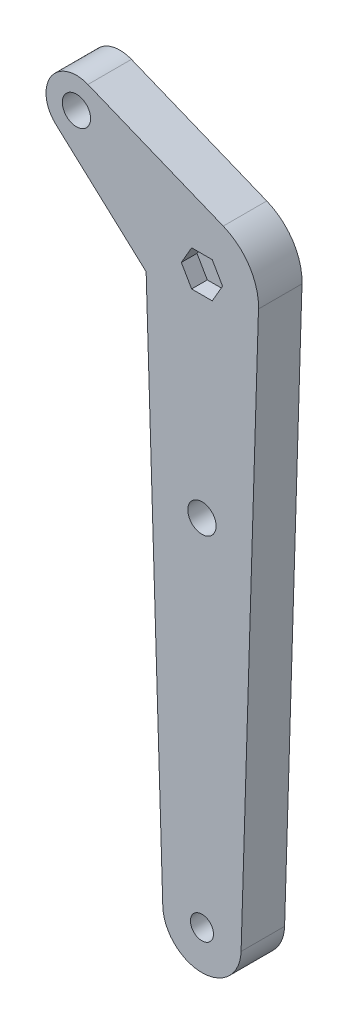
ISO-10303-21;
HEADER;
FILE_DESCRIPTION(('STEP AP214'),'2;1');
FILE_NAME('part.step','',(''),(''),'','','');
FILE_SCHEMA(('AUTOMOTIVE_DESIGN { 1 0 10303 214 1 1 1 1 }'));
ENDSEC;
DATA;
#1=APPLICATION_CONTEXT('core data for automotive mechanical design processes');
#2=APPLICATION_PROTOCOL_DEFINITION('international standard','automotive_design',2000,#1);
#3=PRODUCT_CONTEXT('',#1,'mechanical');
#4=PRODUCT('Part','Part','',(#3));
#5=PRODUCT_RELATED_PRODUCT_CATEGORY('part','',(#4));
#6=PRODUCT_DEFINITION_FORMATION('','',#4);
#7=PRODUCT_DEFINITION_CONTEXT('part definition',#1,'design');
#8=PRODUCT_DEFINITION('design','',#6,#7);
#9=PRODUCT_DEFINITION_SHAPE('','',#8);
#10=(LENGTH_UNIT() NAMED_UNIT(*) SI_UNIT(.MILLI.,.METRE.));
#11=(NAMED_UNIT(*) PLANE_ANGLE_UNIT() SI_UNIT($,.RADIAN.));
#12=(NAMED_UNIT(*) SI_UNIT($,.STERADIAN.) SOLID_ANGLE_UNIT());
#13=UNCERTAINTY_MEASURE_WITH_UNIT(LENGTH_MEASURE(1.E-05),#10,'distance_accuracy_value','');
#14=(GEOMETRIC_REPRESENTATION_CONTEXT(3) GLOBAL_UNCERTAINTY_ASSIGNED_CONTEXT((#13)) GLOBAL_UNIT_ASSIGNED_CONTEXT((#10,
#11,#12)) REPRESENTATION_CONTEXT('',''));
#15=CARTESIAN_POINT('',(0.,0.,0.));
#16=DIRECTION('',(0.,0.,1.));
#17=DIRECTION('',(1.,0.,0.));
#18=AXIS2_PLACEMENT_3D('',#15,#16,#17);
#19=CARTESIAN_POINT('',(300.,170.,358.));
#20=DIRECTION('',(0.,0.,1.));
#21=DIRECTION('',(1.,0.,0.));
#22=AXIS2_PLACEMENT_3D('',#19,#20,#21);
#23=PLANE('',#22);
#24=CARTESIAN_POINT('',(300.,121.5,358.));
#25=DIRECTION('',(0.,0.,1.));
#26=DIRECTION('',(1.,0.,0.));
#27=AXIS2_PLACEMENT_3D('',#24,#25,#26);
#28=CIRCLE('',#27,3.24999999999998);
#29=CARTESIAN_POINT('',(303.25,121.5,358.));
#30=VERTEX_POINT('',#29);
#31=EDGE_CURVE('E174',#30,#30,#28,.F.);
#32=ORIENTED_EDGE('',*,*,#31,.T.);
#33=EDGE_LOOP('',(#32));
#34=FACE_BOUND('',#33,.T.);
#35=CARTESIAN_POINT('',(271.161871074297,188.195504288361,358.));
#36=DIRECTION('',(0.,0.,1.));
#37=DIRECTION('',(1.,0.,0.));
#38=AXIS2_PLACEMENT_3D('',#35,#36,#37);
#39=CIRCLE('',#38,3.24999999999998);
#40=CARTESIAN_POINT('',(274.411871074297,188.195504288361,358.));
#41=VERTEX_POINT('',#40);
#42=EDGE_CURVE('E468',#41,#41,#39,.F.);
#43=ORIENTED_EDGE('',*,*,#42,.T.);
#44=EDGE_LOOP('',(#43));
#45=FACE_BOUND('',#44,.T.);
#46=DIRECTION('',(0.0307692307692308,0.999526515124971,0.));
#47=VECTOR('',#46,1.);
#48=CARTESIAN_POINT('',(308.995738636125,39.7230769230769,358.));
#49=LINE('',#48,#47);
#50=CARTESIAN_POINT('',(308.995738636125,39.7230769230769,358.));
#51=VERTEX_POINT('',#50);
#52=CARTESIAN_POINT('',(312.993844696625,169.6,358.));
#53=VERTEX_POINT('',#52);
#54=EDGE_CURVE('E226',#51,#53,#49,.T.);
#55=ORIENTED_EDGE('',*,*,#54,.T.);
#56=CARTESIAN_POINT('',(300.,170.,358.));
#57=DIRECTION('',(0.,0.,1.));
#58=DIRECTION('',(1.,0.,0.));
#59=AXIS2_PLACEMENT_3D('',#56,#57,#58);
#60=CIRCLE('',#59,13.);
#61=CARTESIAN_POINT('',(304.894163453425,182.043552801859,358.));
#62=VERTEX_POINT('',#61);
#63=EDGE_CURVE('E219',#53,#62,#60,.T.);
#64=ORIENTED_EDGE('',*,*,#63,.T.);
#65=DIRECTION('',(-0.926427138604526,0.376474111801902,0.));
#66=VECTOR('',#65,1.);
#67=CARTESIAN_POINT('',(304.894163453425,182.043552801859,358.));
#68=LINE('',#67,#66);
#69=CARTESIAN_POINT('',(273.79718985691,194.680494258593,358.));
#70=VERTEX_POINT('',#69);
#71=EDGE_CURVE('E192',#62,#70,#68,.T.);
#72=ORIENTED_EDGE('',*,*,#71,.T.);
#73=CARTESIAN_POINT('',(271.161871074297,188.195504288361,358.));
#74=DIRECTION('',(0.,0.,1.));
#75=DIRECTION('',(1.,0.,0.));
#76=AXIS2_PLACEMENT_3D('',#73,#74,#75);
#77=CIRCLE('',#76,7.);
#78=CARTESIAN_POINT('',(266.443148537552,183.025044190728,358.));
#79=VERTEX_POINT('',#78);
#80=EDGE_CURVE('E194',#70,#79,#77,.T.);
#81=ORIENTED_EDGE('',*,*,#80,.T.);
#82=DIRECTION('',(0.738637156804687,-0.674103219535026,0.));
#83=VECTOR('',#82,1.);
#84=CARTESIAN_POINT('',(266.443148537552,183.025044190728,358.));
#85=LINE('',#84,#83);
#86=CARTESIAN_POINT('',(287.175336792298,164.104205018504,358.));
#87=VERTEX_POINT('',#86);
#88=EDGE_CURVE('E197',#79,#87,#85,.T.);
#89=ORIENTED_EDGE('',*,*,#88,.T.);
#90=DIRECTION('',(0.0307692307692308,-0.999526515124971,0.));
#91=VECTOR('',#90,1.);
#92=CARTESIAN_POINT('',(287.006155303375,169.6,358.));
#93=LINE('',#92,#91);
#94=CARTESIAN_POINT('',(291.004261363875,39.7230769230769,358.));
#95=VERTEX_POINT('',#94);
#96=EDGE_CURVE('E221',#87,#95,#93,.T.);
#97=ORIENTED_EDGE('',*,*,#96,.T.);
#98=CARTESIAN_POINT('',(300.,40.,358.));
#99=DIRECTION('',(0.,0.,1.));
#100=DIRECTION('',(1.,0.,0.));
#101=AXIS2_PLACEMENT_3D('',#98,#99,#100);
#102=CIRCLE('',#101,9.00000000000002);
#103=EDGE_CURVE('E224',#95,#51,#102,.T.);
#104=ORIENTED_EDGE('',*,*,#103,.T.);
#105=EDGE_LOOP('',(#55,#64,#72,#81,#89,#97,#104));
#106=FACE_BOUND('',#105,.T.);
#107=CARTESIAN_POINT('',(300.,40.,358.));
#108=DIRECTION('',(0.,0.,1.));
#109=DIRECTION('',(1.,0.,0.));
#110=AXIS2_PLACEMENT_3D('',#107,#108,#109);
#111=CIRCLE('',#110,2.64999999999999);
#112=CARTESIAN_POINT('',(302.65,40.,358.));
#113=VERTEX_POINT('',#112);
#114=EDGE_CURVE('E213',#113,#113,#111,.T.);
#115=ORIENTED_EDGE('',*,*,#114,.F.);
#116=EDGE_LOOP('',(#115));
#117=FACE_BOUND('',#116,.T.);
#118=DIRECTION('',(-0.499999999999998,0.86602540378444,0.));
#119=VECTOR('',#118,1.);
#120=CARTESIAN_POINT('',(304.734272207355,170.,358.));
#121=LINE('',#120,#119);
#122=CARTESIAN_POINT('',(304.734272207355,170.,358.));
#123=VERTEX_POINT('',#122);
#124=CARTESIAN_POINT('',(302.367136103677,174.1,358.));
#125=VERTEX_POINT('',#124);
#126=EDGE_CURVE('E148',#123,#125,#121,.T.);
#127=ORIENTED_EDGE('',*,*,#126,.F.);
#128=DIRECTION('',(0.499999999999998,0.86602540378444,0.));
#129=VECTOR('',#128,1.);
#130=CARTESIAN_POINT('',(302.367136103677,165.9,358.));
#131=LINE('',#130,#129);
#132=CARTESIAN_POINT('',(302.367136103677,165.9,358.));
#133=VERTEX_POINT('',#132);
#134=EDGE_CURVE('E137',#133,#123,#131,.T.);
#135=ORIENTED_EDGE('',*,*,#134,.F.);
#136=DIRECTION('',(1.,0.,0.));
#137=VECTOR('',#136,1.);
#138=CARTESIAN_POINT('',(297.632863896323,165.9,358.));
#139=LINE('',#138,#137);
#140=CARTESIAN_POINT('',(297.632863896323,165.9,358.));
#141=VERTEX_POINT('',#140);
#142=EDGE_CURVE('E170',#141,#133,#139,.T.);
#143=ORIENTED_EDGE('',*,*,#142,.F.);
#144=DIRECTION('',(0.499999999999998,-0.86602540378444,0.));
#145=VECTOR('',#144,1.);
#146=CARTESIAN_POINT('',(295.265727792645,170.,358.));
#147=LINE('',#146,#145);
#148=CARTESIAN_POINT('',(295.265727792645,170.,358.));
#149=VERTEX_POINT('',#148);
#150=EDGE_CURVE('E168',#149,#141,#147,.T.);
#151=ORIENTED_EDGE('',*,*,#150,.F.);
#152=DIRECTION('',(-0.499999999999998,-0.86602540378444,0.));
#153=VECTOR('',#152,1.);
#154=CARTESIAN_POINT('',(297.632863896323,174.1,358.));
#155=LINE('',#154,#153);
#156=CARTESIAN_POINT('',(297.632863896323,174.1,358.));
#157=VERTEX_POINT('',#156);
#158=EDGE_CURVE('E163',#157,#149,#155,.T.);
#159=ORIENTED_EDGE('',*,*,#158,.F.);
#160=DIRECTION('',(-1.,0.,0.));
#161=VECTOR('',#160,1.);
#162=CARTESIAN_POINT('',(302.367136103677,174.1,358.));
#163=LINE('',#162,#161);
#164=EDGE_CURVE('E161',#125,#157,#163,.T.);
#165=ORIENTED_EDGE('',*,*,#164,.F.);
#166=EDGE_LOOP('',(#127,#135,#143,#151,#159,#165));
#167=FACE_BOUND('',#166,.T.);
#168=ADVANCED_FACE('F39',(#34,#45,#106,#117,#167),#23,.T.);
#169=CARTESIAN_POINT('',(300.,170.,358.));
#170=DIRECTION('',(0.,0.,-1.));
#171=DIRECTION('',(-1.,0.,0.));
#172=AXIS2_PLACEMENT_3D('',#169,#170,#171);
#173=CYLINDRICAL_SURFACE('',#172,13.);
#174=DIRECTION('',(0.,0.,-1.));
#175=VECTOR('',#174,1.);
#176=CARTESIAN_POINT('',(304.894163453425,182.043552801859,358.));
#177=LINE('',#176,#175);
#178=CARTESIAN_POINT('',(304.894163453425,182.043552801859,348.));
#179=VERTEX_POINT('',#178);
#180=EDGE_CURVE('E62',#62,#179,#177,.T.);
#181=ORIENTED_EDGE('',*,*,#180,.F.);
#182=ORIENTED_EDGE('',*,*,#63,.F.);
#183=DIRECTION('',(0.,0.,-1.));
#184=VECTOR('',#183,1.);
#185=CARTESIAN_POINT('',(312.993844696625,169.6,358.));
#186=LINE('',#185,#184);
#187=CARTESIAN_POINT('',(312.993844696625,169.6,348.));
#188=VERTEX_POINT('',#187);
#189=EDGE_CURVE('E228',#53,#188,#186,.T.);
#190=ORIENTED_EDGE('',*,*,#189,.T.);
#191=CARTESIAN_POINT('',(300.,170.,348.));
#192=DIRECTION('',(0.,0.,1.));
#193=DIRECTION('',(1.,0.,0.));
#194=AXIS2_PLACEMENT_3D('',#191,#192,#193);
#195=CIRCLE('',#194,13.);
#196=EDGE_CURVE('E216',#188,#179,#195,.T.);
#197=ORIENTED_EDGE('',*,*,#196,.T.);
#198=EDGE_LOOP('',(#181,#182,#190,#197));
#199=FACE_BOUND('',#198,.T.);
#200=ADVANCED_FACE('F41',(#199),#173,.T.);
#201=CARTESIAN_POINT('',(287.006155303375,169.6,358.));
#202=DIRECTION('',(0.999526515124972,0.0307692307692308,0.));
#203=DIRECTION('',(-0.0307692307692308,0.999526515124972,0.));
#204=AXIS2_PLACEMENT_3D('',#201,#202,#203);
#205=PLANE('',#204);
#206=DIRECTION('',(0.,0.,1.));
#207=VECTOR('',#206,1.);
#208=CARTESIAN_POINT('',(287.175336792298,164.104205018504,358.));
#209=LINE('',#208,#207);
#210=CARTESIAN_POINT('',(287.175336792298,164.104205018504,348.));
#211=VERTEX_POINT('',#210);
#212=EDGE_CURVE('E11',#211,#87,#209,.T.);
#213=ORIENTED_EDGE('',*,*,#212,.F.);
#214=DIRECTION('',(0.0307692307692308,-0.999526515124971,0.));
#215=VECTOR('',#214,1.);
#216=CARTESIAN_POINT('',(287.006155303375,169.6,348.));
#217=LINE('',#216,#215);
#218=CARTESIAN_POINT('',(291.004261363875,39.7230769230769,348.));
#219=VERTEX_POINT('',#218);
#220=EDGE_CURVE('E230',#211,#219,#217,.T.);
#221=ORIENTED_EDGE('',*,*,#220,.T.);
#222=DIRECTION('',(0.,0.,-1.));
#223=VECTOR('',#222,1.);
#224=CARTESIAN_POINT('',(291.004261363875,39.7230769230769,358.));
#225=LINE('',#224,#223);
#226=EDGE_CURVE('E47',#95,#219,#225,.T.);
#227=ORIENTED_EDGE('',*,*,#226,.F.);
#228=ORIENTED_EDGE('',*,*,#96,.F.);
#229=EDGE_LOOP('',(#213,#221,#227,#228));
#230=FACE_BOUND('',#229,.T.);
#231=ADVANCED_FACE('F273',(#230),#205,.F.);
#232=CARTESIAN_POINT('',(300.,170.,348.));
#233=DIRECTION('',(0.,0.,1.));
#234=DIRECTION('',(1.,0.,0.));
#235=AXIS2_PLACEMENT_3D('',#232,#233,#234);
#236=PLANE('',#235);
#237=CARTESIAN_POINT('',(300.,70.,348.));
#238=DIRECTION('',(0.,0.,1.));
#239=DIRECTION('',(1.,0.,0.));
#240=AXIS2_PLACEMENT_3D('',#237,#238,#239);
#241=CIRCLE('',#240,2.05);
#242=CARTESIAN_POINT('',(297.95,70.,348.));
#243=VERTEX_POINT('',#242);
#244=EDGE_CURVE('E459',#243,#243,#241,.T.);
#245=ORIENTED_EDGE('',*,*,#244,.T.);
#246=EDGE_LOOP('',(#245));
#247=FACE_BOUND('',#246,.T.);
#248=CARTESIAN_POINT('',(300.,121.5,348.));
#249=DIRECTION('',(0.,0.,1.));
#250=DIRECTION('',(1.,0.,0.));
#251=AXIS2_PLACEMENT_3D('',#248,#249,#250);
#252=CIRCLE('',#251,3.24999999999998);
#253=CARTESIAN_POINT('',(303.25,121.5,348.));
#254=VERTEX_POINT('',#253);
#255=EDGE_CURVE('E462',#254,#254,#252,.T.);
#256=ORIENTED_EDGE('',*,*,#255,.T.);
#257=EDGE_LOOP('',(#256));
#258=FACE_BOUND('',#257,.T.);
#259=CARTESIAN_POINT('',(271.161871074297,188.195504288361,348.));
#260=DIRECTION('',(0.,0.,1.));
#261=DIRECTION('',(1.,0.,0.));
#262=AXIS2_PLACEMENT_3D('',#259,#260,#261);
#263=CIRCLE('',#262,3.24999999999998);
#264=CARTESIAN_POINT('',(274.411871074297,188.195504288361,348.));
#265=VERTEX_POINT('',#264);
#266=EDGE_CURVE('E458',#265,#265,#263,.T.);
#267=ORIENTED_EDGE('',*,*,#266,.T.);
#268=EDGE_LOOP('',(#267));
#269=FACE_BOUND('',#268,.T.);
#270=ORIENTED_EDGE('',*,*,#196,.F.);
#271=DIRECTION('',(0.0307692307692308,0.999526515124971,0.));
#272=VECTOR('',#271,1.);
#273=CARTESIAN_POINT('',(308.995738636125,39.7230769230769,348.));
#274=LINE('',#273,#272);
#275=CARTESIAN_POINT('',(308.995738636125,39.7230769230769,348.));
#276=VERTEX_POINT('',#275);
#277=EDGE_CURVE('E222',#276,#188,#274,.T.);
#278=ORIENTED_EDGE('',*,*,#277,.F.);
#279=CARTESIAN_POINT('',(300.,40.,348.));
#280=DIRECTION('',(0.,0.,1.));
#281=DIRECTION('',(1.,0.,0.));
#282=AXIS2_PLACEMENT_3D('',#279,#280,#281);
#283=CIRCLE('',#282,9.00000000000002);
#284=EDGE_CURVE('E232',#219,#276,#283,.T.);
#285=ORIENTED_EDGE('',*,*,#284,.F.);
#286=ORIENTED_EDGE('',*,*,#220,.F.);
#287=DIRECTION('',(0.738637156804687,-0.674103219535026,0.));
#288=VECTOR('',#287,1.);
#289=CARTESIAN_POINT('',(266.443148537552,183.025044190728,348.));
#290=LINE('',#289,#288);
#291=CARTESIAN_POINT('',(266.443148537552,183.025044190728,348.));
#292=VERTEX_POINT('',#291);
#293=EDGE_CURVE('E195',#292,#211,#290,.T.);
#294=ORIENTED_EDGE('',*,*,#293,.F.);
#295=CARTESIAN_POINT('',(271.161871074297,188.195504288361,348.));
#296=DIRECTION('',(0.,0.,1.));
#297=DIRECTION('',(1.,0.,0.));
#298=AXIS2_PLACEMENT_3D('',#295,#296,#297);
#299=CIRCLE('',#298,7.);
#300=CARTESIAN_POINT('',(273.79718985691,194.680494258593,348.));
#301=VERTEX_POINT('',#300);
#302=EDGE_CURVE('E202',#301,#292,#299,.T.);
#303=ORIENTED_EDGE('',*,*,#302,.F.);
#304=DIRECTION('',(-0.926427138604526,0.376474111801902,0.));
#305=VECTOR('',#304,1.);
#306=CARTESIAN_POINT('',(304.894163453425,182.043552801859,348.));
#307=LINE('',#306,#305);
#308=EDGE_CURVE('E156',#179,#301,#307,.T.);
#309=ORIENTED_EDGE('',*,*,#308,.F.);
#310=EDGE_LOOP('',(#270,#278,#285,#286,#294,#303,#309));
#311=FACE_BOUND('',#310,.T.);
#312=CARTESIAN_POINT('',(300.,40.,348.));
#313=DIRECTION('',(0.,0.,1.));
#314=DIRECTION('',(1.,0.,0.));
#315=AXIS2_PLACEMENT_3D('',#312,#313,#314);
#316=CIRCLE('',#315,2.64999999999999);
#317=CARTESIAN_POINT('',(302.65,40.,348.));
#318=VERTEX_POINT('',#317);
#319=EDGE_CURVE('E212',#318,#318,#316,.T.);
#320=ORIENTED_EDGE('',*,*,#319,.T.);
#321=EDGE_LOOP('',(#320));
#322=FACE_BOUND('',#321,.T.);
#323=ADVANCED_FACE('F250',(#247,#258,#269,#311,#322),#236,.F.);
#324=CARTESIAN_POINT('',(300.,40.,358.));
#325=DIRECTION('',(0.,0.,-1.));
#326=DIRECTION('',(-1.,0.,0.));
#327=AXIS2_PLACEMENT_3D('',#324,#325,#326);
#328=CYLINDRICAL_SURFACE('',#327,9.00000000000002);
#329=ORIENTED_EDGE('',*,*,#284,.T.);
#330=DIRECTION('',(0.,0.,-1.));
#331=VECTOR('',#330,1.);
#332=CARTESIAN_POINT('',(308.995738636125,39.7230769230769,358.));
#333=LINE('',#332,#331);
#334=EDGE_CURVE('E237',#51,#276,#333,.T.);
#335=ORIENTED_EDGE('',*,*,#334,.F.);
#336=ORIENTED_EDGE('',*,*,#103,.F.);
#337=ORIENTED_EDGE('',*,*,#226,.T.);
#338=EDGE_LOOP('',(#329,#335,#336,#337));
#339=FACE_BOUND('',#338,.T.);
#340=ADVANCED_FACE('F244',(#339),#328,.T.);
#341=CARTESIAN_POINT('',(308.995738636125,39.7230769230769,358.));
#342=DIRECTION('',(-0.999526515124972,0.0307692307692308,0.));
#343=DIRECTION('',(-0.0307692307692308,-0.999526515124972,0.));
#344=AXIS2_PLACEMENT_3D('',#341,#342,#343);
#345=PLANE('',#344);
#346=ORIENTED_EDGE('',*,*,#277,.T.);
#347=ORIENTED_EDGE('',*,*,#189,.F.);
#348=ORIENTED_EDGE('',*,*,#54,.F.);
#349=ORIENTED_EDGE('',*,*,#334,.T.);
#350=EDGE_LOOP('',(#346,#347,#348,#349));
#351=FACE_BOUND('',#350,.T.);
#352=ADVANCED_FACE('F257',(#351),#345,.F.);
#353=CARTESIAN_POINT('',(300.,40.,358.));
#354=DIRECTION('',(0.,0.,-1.));
#355=DIRECTION('',(-1.,0.,0.));
#356=AXIS2_PLACEMENT_3D('',#353,#354,#355);
#357=CYLINDRICAL_SURFACE('',#356,2.64999999999999);
#358=ORIENTED_EDGE('',*,*,#114,.T.);
#359=EDGE_LOOP('',(#358));
#360=FACE_BOUND('',#359,.T.);
#361=ORIENTED_EDGE('',*,*,#319,.F.);
#362=EDGE_LOOP('',(#361));
#363=FACE_BOUND('',#362,.T.);
#364=ADVANCED_FACE('F293',(#360,#363),#357,.F.);
#365=CARTESIAN_POINT('',(266.443148537552,183.025044190728,358.));
#366=DIRECTION('',(0.674103219535026,0.738637156804687,0.));
#367=DIRECTION('',(-0.738637156804687,0.674103219535026,0.));
#368=AXIS2_PLACEMENT_3D('',#365,#366,#367);
#369=PLANE('',#368);
#370=ORIENTED_EDGE('',*,*,#293,.T.);
#371=ORIENTED_EDGE('',*,*,#212,.T.);
#372=ORIENTED_EDGE('',*,*,#88,.F.);
#373=DIRECTION('',(0.,0.,-1.));
#374=VECTOR('',#373,1.);
#375=CARTESIAN_POINT('',(266.443148537552,183.025044190728,358.));
#376=LINE('',#375,#374);
#377=EDGE_CURVE('E200',#79,#292,#376,.T.);
#378=ORIENTED_EDGE('',*,*,#377,.T.);
#379=EDGE_LOOP('',(#370,#371,#372,#378));
#380=FACE_BOUND('',#379,.T.);
#381=ADVANCED_FACE('F272',(#380),#369,.F.);
#382=CARTESIAN_POINT('',(304.894163453425,182.043552801859,358.));
#383=DIRECTION('',(-0.376474111801902,-0.926427138604526,0.));
#384=DIRECTION('',(0.926427138604526,-0.376474111801902,0.));
#385=AXIS2_PLACEMENT_3D('',#382,#383,#384);
#386=PLANE('',#385);
#387=ORIENTED_EDGE('',*,*,#308,.T.);
#388=DIRECTION('',(0.,0.,-1.));
#389=VECTOR('',#388,1.);
#390=CARTESIAN_POINT('',(273.79718985691,194.680494258593,358.));
#391=LINE('',#390,#389);
#392=EDGE_CURVE('E208',#70,#301,#391,.T.);
#393=ORIENTED_EDGE('',*,*,#392,.F.);
#394=ORIENTED_EDGE('',*,*,#71,.F.);
#395=ORIENTED_EDGE('',*,*,#180,.T.);
#396=EDGE_LOOP('',(#387,#393,#394,#395));
#397=FACE_BOUND('',#396,.T.);
#398=ADVANCED_FACE('F264',(#397),#386,.F.);
#399=CARTESIAN_POINT('',(271.161871074297,188.195504288361,358.));
#400=DIRECTION('',(0.,0.,-1.));
#401=DIRECTION('',(-1.,0.,0.));
#402=AXIS2_PLACEMENT_3D('',#399,#400,#401);
#403=CYLINDRICAL_SURFACE('',#402,7.);
#404=ORIENTED_EDGE('',*,*,#302,.T.);
#405=ORIENTED_EDGE('',*,*,#377,.F.);
#406=ORIENTED_EDGE('',*,*,#80,.F.);
#407=ORIENTED_EDGE('',*,*,#392,.T.);
#408=EDGE_LOOP('',(#404,#405,#406,#407));
#409=FACE_BOUND('',#408,.T.);
#410=ADVANCED_FACE('F269',(#409),#403,.T.);
#411=CARTESIAN_POINT('',(302.367136103677,165.9,358.));
#412=DIRECTION('',(-0.86602540378444,0.499999999999998,0.));
#413=DIRECTION('',(-0.499999999999998,-0.86602540378444,0.));
#414=AXIS2_PLACEMENT_3D('',#411,#412,#413);
#415=PLANE('',#414);
#416=DIRECTION('',(0.499999999999998,0.86602540378444,0.));
#417=VECTOR('',#416,1.);
#418=CARTESIAN_POINT('',(302.367136103677,165.9,354.4));
#419=LINE('',#418,#417);
#420=CARTESIAN_POINT('',(302.367136103677,165.9,354.4));
#421=VERTEX_POINT('',#420);
#422=CARTESIAN_POINT('',(304.734272207355,170.,354.4));
#423=VERTEX_POINT('',#422);
#424=EDGE_CURVE('E172',#421,#423,#419,.T.);
#425=ORIENTED_EDGE('',*,*,#424,.F.);
#426=DIRECTION('',(0.,0.,-1.));
#427=VECTOR('',#426,1.);
#428=CARTESIAN_POINT('',(302.367136103677,165.9,358.));
#429=LINE('',#428,#427);
#430=EDGE_CURVE('E144',#133,#421,#429,.T.);
#431=ORIENTED_EDGE('',*,*,#430,.F.);
#432=ORIENTED_EDGE('',*,*,#134,.T.);
#433=DIRECTION('',(0.,0.,-1.));
#434=VECTOR('',#433,1.);
#435=CARTESIAN_POINT('',(304.734272207355,170.,358.));
#436=LINE('',#435,#434);
#437=EDGE_CURVE('E141',#123,#423,#436,.T.);
#438=ORIENTED_EDGE('',*,*,#437,.T.);
#439=EDGE_LOOP('',(#425,#431,#432,#438));
#440=FACE_BOUND('',#439,.T.);
#441=ADVANCED_FACE('F140',(#440),#415,.T.);
#442=CARTESIAN_POINT('',(304.734272207355,170.,358.));
#443=DIRECTION('',(-0.86602540378444,-0.499999999999998,0.));
#444=DIRECTION('',(0.499999999999998,-0.86602540378444,0.));
#445=AXIS2_PLACEMENT_3D('',#442,#443,#444);
#446=PLANE('',#445);
#447=DIRECTION('',(-0.499999999999998,0.86602540378444,0.));
#448=VECTOR('',#447,1.);
#449=CARTESIAN_POINT('',(304.734272207355,170.,354.4));
#450=LINE('',#449,#448);
#451=CARTESIAN_POINT('',(302.367136103677,174.1,354.4));
#452=VERTEX_POINT('',#451);
#453=EDGE_CURVE('E155',#423,#452,#450,.T.);
#454=ORIENTED_EDGE('',*,*,#453,.F.);
#455=ORIENTED_EDGE('',*,*,#437,.F.);
#456=ORIENTED_EDGE('',*,*,#126,.T.);
#457=DIRECTION('',(0.,0.,-1.));
#458=VECTOR('',#457,1.);
#459=CARTESIAN_POINT('',(302.367136103677,174.1,358.));
#460=LINE('',#459,#458);
#461=EDGE_CURVE('E157',#125,#452,#460,.T.);
#462=ORIENTED_EDGE('',*,*,#461,.T.);
#463=EDGE_LOOP('',(#454,#455,#456,#462));
#464=FACE_BOUND('',#463,.T.);
#465=ADVANCED_FACE('F152',(#464),#446,.T.);
#466=CARTESIAN_POINT('',(302.367136103677,174.1,358.));
#467=DIRECTION('',(0.,-1.,0.));
#468=DIRECTION('',(0.,0.,-1.));
#469=AXIS2_PLACEMENT_3D('',#466,#467,#468);
#470=PLANE('',#469);
#471=DIRECTION('',(-1.,0.,0.));
#472=VECTOR('',#471,1.);
#473=CARTESIAN_POINT('',(302.367136103677,174.1,354.4));
#474=LINE('',#473,#472);
#475=CARTESIAN_POINT('',(297.632863896323,174.1,354.4));
#476=VERTEX_POINT('',#475);
#477=EDGE_CURVE('E176',#452,#476,#474,.T.);
#478=ORIENTED_EDGE('',*,*,#477,.F.);
#479=ORIENTED_EDGE('',*,*,#461,.F.);
#480=ORIENTED_EDGE('',*,*,#164,.T.);
#481=DIRECTION('',(0.,0.,-1.));
#482=VECTOR('',#481,1.);
#483=CARTESIAN_POINT('',(297.632863896323,174.1,358.));
#484=LINE('',#483,#482);
#485=EDGE_CURVE('E188',#157,#476,#484,.T.);
#486=ORIENTED_EDGE('',*,*,#485,.T.);
#487=EDGE_LOOP('',(#478,#479,#480,#486));
#488=FACE_BOUND('',#487,.T.);
#489=ADVANCED_FACE('F361',(#488),#470,.T.);
#490=CARTESIAN_POINT('',(297.632863896323,174.1,358.));
#491=DIRECTION('',(0.86602540378444,-0.499999999999998,0.));
#492=DIRECTION('',(0.499999999999998,0.86602540378444,0.));
#493=AXIS2_PLACEMENT_3D('',#490,#491,#492);
#494=PLANE('',#493);
#495=DIRECTION('',(-0.499999999999998,-0.86602540378444,0.));
#496=VECTOR('',#495,1.);
#497=CARTESIAN_POINT('',(297.632863896323,174.1,354.4));
#498=LINE('',#497,#496);
#499=CARTESIAN_POINT('',(295.265727792645,170.,354.4));
#500=VERTEX_POINT('',#499);
#501=EDGE_CURVE('E178',#476,#500,#498,.T.);
#502=ORIENTED_EDGE('',*,*,#501,.F.);
#503=ORIENTED_EDGE('',*,*,#485,.F.);
#504=ORIENTED_EDGE('',*,*,#158,.T.);
#505=DIRECTION('',(0.,0.,-1.));
#506=VECTOR('',#505,1.);
#507=CARTESIAN_POINT('',(295.265727792645,170.,358.));
#508=LINE('',#507,#506);
#509=EDGE_CURVE('E185',#149,#500,#508,.T.);
#510=ORIENTED_EDGE('',*,*,#509,.T.);
#511=EDGE_LOOP('',(#502,#503,#504,#510));
#512=FACE_BOUND('',#511,.T.);
#513=ADVANCED_FACE('F369',(#512),#494,.T.);
#514=CARTESIAN_POINT('',(295.265727792645,170.,358.));
#515=DIRECTION('',(0.86602540378444,0.499999999999998,0.));
#516=DIRECTION('',(-0.499999999999998,0.86602540378444,0.));
#517=AXIS2_PLACEMENT_3D('',#514,#515,#516);
#518=PLANE('',#517);
#519=DIRECTION('',(0.499999999999998,-0.86602540378444,0.));
#520=VECTOR('',#519,1.);
#521=CARTESIAN_POINT('',(295.265727792645,170.,354.4));
#522=LINE('',#521,#520);
#523=CARTESIAN_POINT('',(297.632863896323,165.9,354.4));
#524=VERTEX_POINT('',#523);
#525=EDGE_CURVE('E180',#500,#524,#522,.T.);
#526=ORIENTED_EDGE('',*,*,#525,.F.);
#527=ORIENTED_EDGE('',*,*,#509,.F.);
#528=ORIENTED_EDGE('',*,*,#150,.T.);
#529=DIRECTION('',(0.,0.,-1.));
#530=VECTOR('',#529,1.);
#531=CARTESIAN_POINT('',(297.632863896323,165.9,358.));
#532=LINE('',#531,#530);
#533=EDGE_CURVE('E54',#141,#524,#532,.T.);
#534=ORIENTED_EDGE('',*,*,#533,.T.);
#535=EDGE_LOOP('',(#526,#527,#528,#534));
#536=FACE_BOUND('',#535,.T.);
#537=ADVANCED_FACE('F378',(#536),#518,.T.);
#538=CARTESIAN_POINT('',(297.632863896323,165.9,358.));
#539=DIRECTION('',(0.,1.,0.));
#540=DIRECTION('',(0.,0.,1.));
#541=AXIS2_PLACEMENT_3D('',#538,#539,#540);
#542=PLANE('',#541);
#543=DIRECTION('',(1.,0.,0.));
#544=VECTOR('',#543,1.);
#545=CARTESIAN_POINT('',(297.632863896323,165.9,354.4));
#546=LINE('',#545,#544);
#547=EDGE_CURVE('E149',#524,#421,#546,.T.);
#548=ORIENTED_EDGE('',*,*,#547,.F.);
#549=ORIENTED_EDGE('',*,*,#533,.F.);
#550=ORIENTED_EDGE('',*,*,#142,.T.);
#551=ORIENTED_EDGE('',*,*,#430,.T.);
#552=EDGE_LOOP('',(#548,#549,#550,#551));
#553=FACE_BOUND('',#552,.T.);
#554=ADVANCED_FACE('F387',(#553),#542,.T.);
#555=CARTESIAN_POINT('',(0.,0.,354.4));
#556=DIRECTION('',(0.,0.,1.));
#557=DIRECTION('',(1.,0.,0.));
#558=AXIS2_PLACEMENT_3D('',#555,#556,#557);
#559=PLANE('',#558);
#560=ORIENTED_EDGE('',*,*,#424,.T.);
#561=ORIENTED_EDGE('',*,*,#453,.T.);
#562=ORIENTED_EDGE('',*,*,#477,.T.);
#563=ORIENTED_EDGE('',*,*,#501,.T.);
#564=ORIENTED_EDGE('',*,*,#525,.T.);
#565=ORIENTED_EDGE('',*,*,#547,.T.);
#566=EDGE_LOOP('',(#560,#561,#562,#563,#564,#565));
#567=FACE_BOUND('',#566,.T.);
#568=ADVANCED_FACE('F396',(#567),#559,.T.);
#569=CARTESIAN_POINT('',(271.161871074297,188.195504288361,398.));
#570=DIRECTION('',(0.,0.,-1.));
#571=DIRECTION('',(-1.,0.,0.));
#572=AXIS2_PLACEMENT_3D('',#569,#570,#571);
#573=CYLINDRICAL_SURFACE('',#572,3.24999999999998);
#574=ORIENTED_EDGE('',*,*,#42,.F.);
#575=EDGE_LOOP('',(#574));
#576=FACE_BOUND('',#575,.T.);
#577=ORIENTED_EDGE('',*,*,#266,.F.);
#578=EDGE_LOOP('',(#577));
#579=FACE_BOUND('',#578,.T.);
#580=ADVANCED_FACE('F403',(#576,#579),#573,.F.);
#581=CARTESIAN_POINT('',(300.,121.5,398.));
#582=DIRECTION('',(0.,0.,-1.));
#583=DIRECTION('',(-1.,0.,0.));
#584=AXIS2_PLACEMENT_3D('',#581,#582,#583);
#585=CYLINDRICAL_SURFACE('',#584,3.24999999999998);
#586=ORIENTED_EDGE('',*,*,#31,.F.);
#587=EDGE_LOOP('',(#586));
#588=FACE_BOUND('',#587,.T.);
#589=ORIENTED_EDGE('',*,*,#255,.F.);
#590=EDGE_LOOP('',(#589));
#591=FACE_BOUND('',#590,.T.);
#592=ADVANCED_FACE('F411',(#588,#591),#585,.F.);
#593=CARTESIAN_POINT('',(300.,70.,354.7));
#594=DIRECTION('',(0.,0.,-1.));
#595=DIRECTION('',(-1.,0.,0.));
#596=AXIS2_PLACEMENT_3D('',#593,#594,#595);
#597=CYLINDRICAL_SURFACE('',#596,2.05);
#598=CARTESIAN_POINT('',(300.,70.,354.7));
#599=DIRECTION('',(0.,0.,1.));
#600=DIRECTION('',(1.,0.,0.));
#601=AXIS2_PLACEMENT_3D('',#598,#599,#600);
#602=CIRCLE('',#601,2.05);
#603=CARTESIAN_POINT('',(297.95,70.,354.7));
#604=VERTEX_POINT('',#603);
#605=EDGE_CURVE('E457',#604,#604,#602,.T.);
#606=CARTESIAN_POINT('',(297.95,70.,354.7));
#607=CARTESIAN_POINT('',(297.95,70.,354.630208333333));
#608=CARTESIAN_POINT('',(297.95,70.,354.560416666667));
#609=CARTESIAN_POINT('',(297.95,70.,354.420833333333));
#610=CARTESIAN_POINT('',(297.95,70.,354.351041666667));
#611=CARTESIAN_POINT('',(297.95,70.,354.211458333333));
#612=CARTESIAN_POINT('',(297.95,70.,354.141666666667));
#613=CARTESIAN_POINT('',(297.95,70.,354.002083333333));
#614=CARTESIAN_POINT('',(297.95,70.,353.932291666667));
#615=CARTESIAN_POINT('',(297.95,70.,353.792708333333));
#616=CARTESIAN_POINT('',(297.95,70.,353.722916666667));
#617=CARTESIAN_POINT('',(297.95,70.,353.583333333333));
#618=CARTESIAN_POINT('',(297.95,70.,353.513541666667));
#619=CARTESIAN_POINT('',(297.95,70.,353.373958333333));
#620=CARTESIAN_POINT('',(297.95,70.,353.304166666667));
#621=CARTESIAN_POINT('',(297.95,70.,353.164583333333));
#622=CARTESIAN_POINT('',(297.95,70.,353.094791666667));
#623=CARTESIAN_POINT('',(297.95,70.,352.955208333333));
#624=CARTESIAN_POINT('',(297.95,70.,352.885416666667));
#625=CARTESIAN_POINT('',(297.95,70.,352.745833333333));
#626=CARTESIAN_POINT('',(297.95,70.,352.676041666667));
#627=CARTESIAN_POINT('',(297.95,70.,352.536458333333));
#628=CARTESIAN_POINT('',(297.95,70.,352.466666666667));
#629=CARTESIAN_POINT('',(297.95,70.,352.327083333333));
#630=CARTESIAN_POINT('',(297.95,70.,352.257291666667));
#631=CARTESIAN_POINT('',(297.95,70.,352.117708333333));
#632=CARTESIAN_POINT('',(297.95,70.,352.047916666667));
#633=CARTESIAN_POINT('',(297.95,70.,351.908333333333));
#634=CARTESIAN_POINT('',(297.95,70.,351.838541666667));
#635=CARTESIAN_POINT('',(297.95,70.,351.698958333333));
#636=CARTESIAN_POINT('',(297.95,70.,351.629166666667));
#637=CARTESIAN_POINT('',(297.95,70.,351.489583333333));
#638=CARTESIAN_POINT('',(297.95,70.,351.419791666667));
#639=CARTESIAN_POINT('',(297.95,70.,351.280208333333));
#640=CARTESIAN_POINT('',(297.95,70.,351.210416666667));
#641=CARTESIAN_POINT('',(297.95,70.,351.070833333333));
#642=CARTESIAN_POINT('',(297.95,70.,351.001041666667));
#643=CARTESIAN_POINT('',(297.95,70.,350.861458333333));
#644=CARTESIAN_POINT('',(297.95,70.,350.791666666667));
#645=CARTESIAN_POINT('',(297.95,70.,350.652083333333));
#646=CARTESIAN_POINT('',(297.95,70.,350.582291666667));
#647=CARTESIAN_POINT('',(297.95,70.,350.442708333333));
#648=CARTESIAN_POINT('',(297.95,70.,350.372916666667));
#649=CARTESIAN_POINT('',(297.95,70.,350.233333333333));
#650=CARTESIAN_POINT('',(297.95,70.,350.163541666667));
#651=CARTESIAN_POINT('',(297.95,70.,350.023958333333));
#652=CARTESIAN_POINT('',(297.95,70.,349.954166666667));
#653=CARTESIAN_POINT('',(297.95,70.,349.814583333333));
#654=CARTESIAN_POINT('',(297.95,70.,349.744791666667));
#655=CARTESIAN_POINT('',(297.95,70.,349.605208333333));
#656=CARTESIAN_POINT('',(297.95,70.,349.535416666667));
#657=CARTESIAN_POINT('',(297.95,70.,349.395833333333));
#658=CARTESIAN_POINT('',(297.95,70.,349.326041666667));
#659=CARTESIAN_POINT('',(297.95,70.,349.186458333333));
#660=CARTESIAN_POINT('',(297.95,70.,349.116666666667));
#661=CARTESIAN_POINT('',(297.95,70.,348.977083333333));
#662=CARTESIAN_POINT('',(297.95,70.,348.907291666667));
#663=CARTESIAN_POINT('',(297.95,70.,348.767708333333));
#664=CARTESIAN_POINT('',(297.95,70.,348.697916666667));
#665=CARTESIAN_POINT('',(297.95,70.,348.558333333333));
#666=CARTESIAN_POINT('',(297.95,70.,348.488541666667));
#667=CARTESIAN_POINT('',(297.95,70.,348.348958333333));
#668=CARTESIAN_POINT('',(297.95,70.,348.279166666667));
#669=CARTESIAN_POINT('',(297.95,70.,348.139583333333));
#670=CARTESIAN_POINT('',(297.95,70.,348.069791666667));
#671=CARTESIAN_POINT('',(297.95,70.,348.));
#672=B_SPLINE_CURVE_WITH_KNOTS('',3,(#606,#607,#608,#609,#610,#611,#612,#613,#614,#615,#616,
#617,#618,#619,#620,#621,#622,#623,#624,#625,#626,#627,#628,#629,#630,#631,#632,#633,#634,#635,
#636,#637,#638,#639,#640,#641,#642,#643,#644,#645,#646,#647,#648,#649,#650,#651,#652,#653,#654,
#655,#656,#657,#658,#659,#660,#661,#662,#663,#664,#665,#666,#667,#668,#669,#670,#671),
.UNSPECIFIED.,.F.,.F.,(4,2,2,2,2,2,2,2,2,2,2,2,2,2,2,2,2,2,2,2,2,2,2,2,2,2,2,2,2,2,2,2,4),(0.,
0.209374999999956,0.418749999999968,0.628124999999979,0.837499999999991,1.04687499999995,
1.25624999999996,1.46562499999997,1.67499999999998,1.88437499999999,2.09374999999995,
2.30312499999996,2.51249999999997,2.72187499999998,2.93124999999994,3.14062499999995,
3.34999999999996,3.55937499999998,3.76874999999999,3.97812499999994,4.18749999999996,
4.39687499999997,4.60624999999998,4.81562499999993,5.02499999999995,5.23437499999996,
5.44374999999997,5.65312499999998,5.86249999999994,6.07187499999995,6.28124999999996,
6.49062499999997,6.69999999999993),.UNSPECIFIED.);
#673=EDGE_CURVE('BSEAM420',#604,#243,#672,.T.);
#674=ORIENTED_EDGE('',*,*,#605,.T.);
#675=ORIENTED_EDGE('',*,*,#244,.F.);
#676=ORIENTED_EDGE('',*,*,#673,.T.);
#677=ORIENTED_EDGE('',*,*,#673,.F.);
#678=EDGE_LOOP('',(#674,#676,#675,#677));
#679=FACE_BOUND('',#678,.T.);
#680=ADVANCED_FACE('F420',(#679),#597,.F.);
#681=CARTESIAN_POINT('',(300.,70.,354.7));
#682=DIRECTION('',(0.,0.,1.));
#683=DIRECTION('',(1.,0.,0.));
#684=AXIS2_PLACEMENT_3D('',#681,#682,#683);
#685=PLANE('',#684);
#686=ORIENTED_EDGE('',*,*,#605,.F.);
#687=EDGE_LOOP('',(#686));
#688=FACE_BOUND('',#687,.T.);
#689=ADVANCED_FACE('F429',(#688),#685,.F.);
#690=CLOSED_SHELL('',(#168,#200,#231,#323,#340,#352,#364,#381,#398,#410,#441,#465,#489,#513,
#537,#554,#568,#580,#592,#680,#689));
#691=MANIFOLD_SOLID_BREP('B2',#690);
#692=ADVANCED_BREP_SHAPE_REPRESENTATION('',(#18,#691),#14);
#693=SHAPE_DEFINITION_REPRESENTATION(#9,#692);
ENDSEC;
END-ISO-10303-21;
